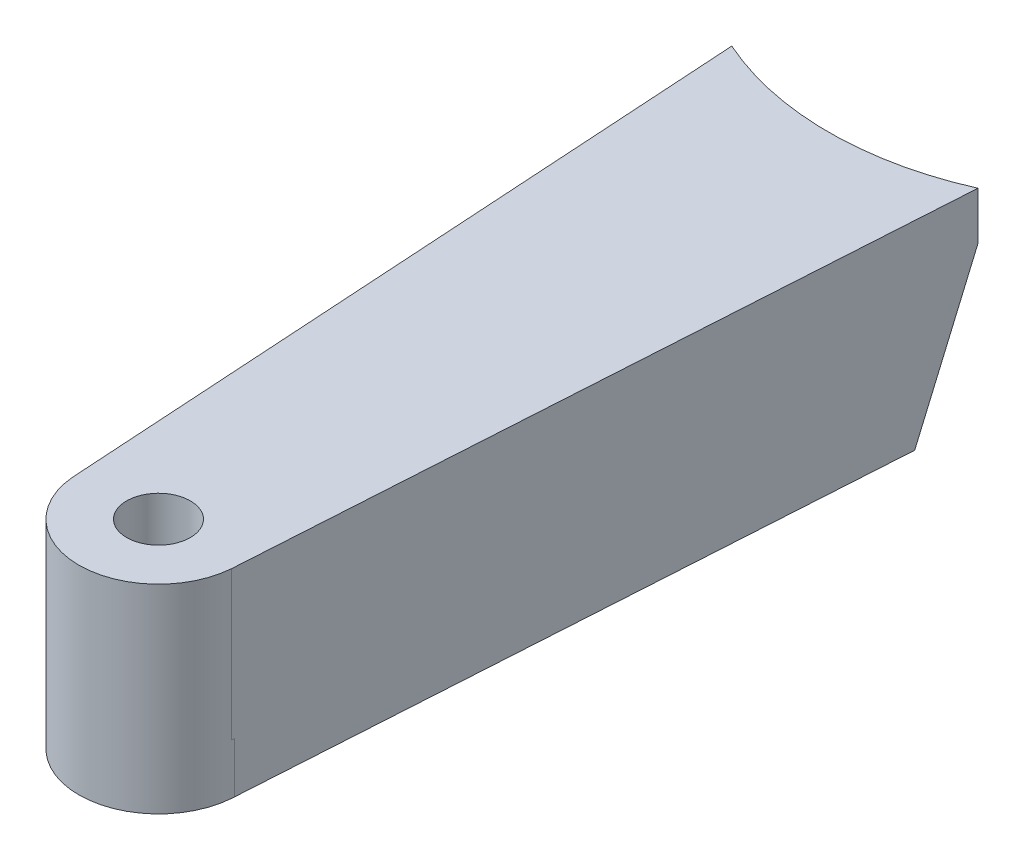
ISO-10303-21;
HEADER;
FILE_DESCRIPTION(('STEP AP214'),'2;1');
FILE_NAME('part.step','',(''),(''),'','','');
FILE_SCHEMA(('AUTOMOTIVE_DESIGN { 1 0 10303 214 1 1 1 1 }'));
ENDSEC;
DATA;
#1=APPLICATION_CONTEXT('core data for automotive mechanical design processes');
#2=APPLICATION_PROTOCOL_DEFINITION('international standard','automotive_design',2000,#1);
#3=PRODUCT_CONTEXT('',#1,'mechanical');
#4=PRODUCT('Part','Part','',(#3));
#5=PRODUCT_RELATED_PRODUCT_CATEGORY('part','',(#4));
#6=PRODUCT_DEFINITION_FORMATION('','',#4);
#7=PRODUCT_DEFINITION_CONTEXT('part definition',#1,'design');
#8=PRODUCT_DEFINITION('design','',#6,#7);
#9=PRODUCT_DEFINITION_SHAPE('','',#8);
#10=(LENGTH_UNIT() NAMED_UNIT(*) SI_UNIT(.MILLI.,.METRE.));
#11=(NAMED_UNIT(*) PLANE_ANGLE_UNIT() SI_UNIT($,.RADIAN.));
#12=(NAMED_UNIT(*) SI_UNIT($,.STERADIAN.) SOLID_ANGLE_UNIT());
#13=UNCERTAINTY_MEASURE_WITH_UNIT(LENGTH_MEASURE(1.E-05),#10,'distance_accuracy_value','');
#14=(GEOMETRIC_REPRESENTATION_CONTEXT(3) GLOBAL_UNCERTAINTY_ASSIGNED_CONTEXT((#13)) GLOBAL_UNIT_ASSIGNED_CONTEXT((#10,
#11,#12)) REPRESENTATION_CONTEXT('',''));
#15=CARTESIAN_POINT('',(0.,0.,0.));
#16=DIRECTION('',(0.,0.,1.));
#17=DIRECTION('',(1.,0.,0.));
#18=AXIS2_PLACEMENT_3D('',#15,#16,#17);
#19=CARTESIAN_POINT('',(15.,25.,80.));
#20=DIRECTION('',(0.,-1.,0.));
#21=DIRECTION('',(0.,0.,-1.));
#22=AXIS2_PLACEMENT_3D('',#19,#20,#21);
#23=CYLINDRICAL_SURFACE('',#22,10.);
#24=DIRECTION('',(0.,1.,0.));
#25=VECTOR('',#24,1.);
#26=CARTESIAN_POINT('',(20.5269931596302,0.,71.6661925500165));
#27=LINE('',#26,#25);
#28=CARTESIAN_POINT('',(20.5269931596302,6.35,71.6661925500165));
#29=VERTEX_POINT('',#28);
#30=CARTESIAN_POINT('',(20.5269931596302,19.,71.6661925500165));
#31=VERTEX_POINT('',#30);
#32=EDGE_CURVE('E128',#29,#31,#27,.T.);
#33=ORIENTED_EDGE('',*,*,#32,.F.);
#34=CARTESIAN_POINT('',(15.,6.35,80.));
#35=DIRECTION('',(0.,1.,0.));
#36=DIRECTION('',(0.,0.,1.));
#37=AXIS2_PLACEMENT_3D('',#34,#35,#36);
#38=CIRCLE('',#37,10.);
#39=CARTESIAN_POINT('',(5.00953868123267,6.35,80.436672232016));
#40=VERTEX_POINT('',#39);
#41=EDGE_CURVE('E264',#40,#29,#38,.F.);
#42=ORIENTED_EDGE('',*,*,#41,.F.);
#43=DIRECTION('',(0.,-1.,0.));
#44=VECTOR('',#43,1.);
#45=CARTESIAN_POINT('',(5.00953868123267,25.,80.436672232016));
#46=LINE('',#45,#44);
#47=CARTESIAN_POINT('',(5.00953868123267,19.,80.436672232016));
#48=VERTEX_POINT('',#47);
#49=EDGE_CURVE('E251',#48,#40,#46,.T.);
#50=ORIENTED_EDGE('',*,*,#49,.F.);
#51=CARTESIAN_POINT('',(15.,19.,80.));
#52=DIRECTION('',(0.,1.,0.));
#53=DIRECTION('',(0.,0.,1.));
#54=AXIS2_PLACEMENT_3D('',#51,#52,#53);
#55=CIRCLE('',#54,10.);
#56=EDGE_CURVE('E247',#31,#48,#55,.T.);
#57=ORIENTED_EDGE('',*,*,#56,.F.);
#58=EDGE_LOOP('',(#33,#42,#50,#57));
#59=FACE_BOUND('',#58,.T.);
#60=ADVANCED_FACE('F102',(#59),#23,.T.);
#61=CARTESIAN_POINT('',(0.,6.35,0.));
#62=DIRECTION('',(0.,1.,0.));
#63=DIRECTION('',(0.,0.,1.));
#64=AXIS2_PLACEMENT_3D('',#61,#62,#63);
#65=PLANE('',#64);
#66=ORIENTED_EDGE('',*,*,#41,.T.);
#67=DIRECTION('',(0.0621588566545773,0.,-0.998066268611156));
#68=VECTOR('',#67,1.);
#69=CARTESIAN_POINT('',(24.8937569531261,6.35,1.5503654603982));
#70=LINE('',#69,#68);
#71=CARTESIAN_POINT('',(24.8662216418089,6.35,1.99249176227189));
#72=VERTEX_POINT('',#71);
#73=EDGE_CURVE('E173',#29,#72,#70,.T.);
#74=ORIENTED_EDGE('',*,*,#73,.T.);
#75=CARTESIAN_POINT('',(15.,6.35,-31.0384337426189));
#76=DIRECTION('',(0.,1.,0.));
#77=DIRECTION('',(0.,0.,1.));
#78=AXIS2_PLACEMENT_3D('',#75,#76,#77);
#79=CIRCLE('',#78,34.4729512690014);
#80=CARTESIAN_POINT('',(0.,6.35,0.));
#81=VERTEX_POINT('',#80);
#82=EDGE_CURVE('E168',#81,#72,#79,.T.);
#83=ORIENTED_EDGE('',*,*,#82,.F.);
#84=DIRECTION('',(0.0621588566545779,0.,0.998066268611156));
#85=VECTOR('',#84,1.);
#86=CARTESIAN_POINT('',(0.,6.35,0.));
#87=LINE('',#86,#85);
#88=EDGE_CURVE('E421',#81,#40,#87,.T.);
#89=ORIENTED_EDGE('',*,*,#88,.T.);
#90=EDGE_LOOP('',(#66,#74,#83,#89));
#91=FACE_BOUND('',#90,.T.);
#92=ADVANCED_FACE('F315',(#91),#65,.T.);
#93=CARTESIAN_POINT('',(15.,6.35,-31.0384337426189));
#94=DIRECTION('',(0.,-1.,0.));
#95=DIRECTION('',(0.,0.,-1.));
#96=AXIS2_PLACEMENT_3D('',#93,#94,#95);
#97=CYLINDRICAL_SURFACE('',#96,34.4729512690014);
#98=ORIENTED_EDGE('',*,*,#82,.T.);
#99=DIRECTION('',(0.,-1.,0.));
#100=VECTOR('',#99,1.);
#101=CARTESIAN_POINT('',(24.8662216418089,6.35,1.99249176227189));
#102=LINE('',#101,#100);
#103=CARTESIAN_POINT('',(24.8662216418089,0.,1.99249176227188));
#104=VERTEX_POINT('',#103);
#105=EDGE_CURVE('E161',#72,#104,#102,.T.);
#106=ORIENTED_EDGE('',*,*,#105,.T.);
#107=CARTESIAN_POINT('',(15.,0.,-31.0384337426189));
#108=DIRECTION('',(0.,1.,0.));
#109=DIRECTION('',(0.,0.,1.));
#110=AXIS2_PLACEMENT_3D('',#107,#108,#109);
#111=CIRCLE('',#110,34.4729512690014);
#112=CARTESIAN_POINT('',(0.,0.,0.));
#113=VERTEX_POINT('',#112);
#114=EDGE_CURVE('E166',#113,#104,#111,.T.);
#115=ORIENTED_EDGE('',*,*,#114,.F.);
#116=DIRECTION('',(0.,-1.,0.));
#117=VECTOR('',#116,1.);
#118=CARTESIAN_POINT('',(0.,6.35,0.));
#119=LINE('',#118,#117);
#120=EDGE_CURVE('E260',#81,#113,#119,.T.);
#121=ORIENTED_EDGE('',*,*,#120,.F.);
#122=EDGE_LOOP('',(#98,#106,#115,#121));
#123=FACE_BOUND('',#122,.T.);
#124=ADVANCED_FACE('F163',(#123),#97,.F.);
#125=CARTESIAN_POINT('',(0.,19.,0.));
#126=DIRECTION('',(0.,1.,0.));
#127=DIRECTION('',(0.,0.,1.));
#128=AXIS2_PLACEMENT_3D('',#125,#126,#127);
#129=PLANE('',#128);
#130=DIRECTION('',(-0.0621588566545773,0.,0.998066268611156));
#131=VECTOR('',#130,1.);
#132=CARTESIAN_POINT('',(24.8937569531261,19.,1.5503654603982));
#133=LINE('',#132,#131);
#134=CARTESIAN_POINT('',(25.3411495067401,19.,-5.63328367059114));
#135=VERTEX_POINT('',#134);
#136=EDGE_CURVE('E204',#135,#31,#133,.T.);
#137=ORIENTED_EDGE('',*,*,#136,.T.);
#138=ORIENTED_EDGE('',*,*,#56,.T.);
#139=DIRECTION('',(0.0621588566545778,0.,0.998066268611156));
#140=VECTOR('',#139,1.);
#141=CARTESIAN_POINT('',(0.,19.,0.));
#142=LINE('',#141,#140);
#143=CARTESIAN_POINT('',(-0.466218615116113,19.,-7.48593359964466));
#144=VERTEX_POINT('',#143);
#145=EDGE_CURVE('E230',#144,#48,#142,.T.);
#146=ORIENTED_EDGE('',*,*,#145,.F.);
#147=CARTESIAN_POINT('',(15.,19.,-42.2556521929486));
#148=DIRECTION('',(0.,1.,0.));
#149=DIRECTION('',(0.,0.,1.));
#150=AXIS2_PLACEMENT_3D('',#147,#148,#149);
#151=CIRCLE('',#150,38.0543985540189);
#152=EDGE_CURVE('E227',#144,#135,#151,.T.);
#153=ORIENTED_EDGE('',*,*,#152,.T.);
#154=EDGE_LOOP('',(#137,#138,#146,#153));
#155=FACE_BOUND('',#154,.T.);
#156=ADVANCED_FACE('F418',(#155),#129,.F.);
#157=CARTESIAN_POINT('',(0.,6.35,0.));
#158=DIRECTION('',(0.998066268611156,0.,-0.0621588566545778));
#159=DIRECTION('',(-0.0621588566545779,0.,-0.998066268611156));
#160=AXIS2_PLACEMENT_3D('',#157,#158,#159);
#161=PLANE('',#160);
#162=DIRECTION('',(0.0621588566545779,0.,0.998066268611156));
#163=VECTOR('',#162,1.);
#164=CARTESIAN_POINT('',(0.,0.,0.));
#165=LINE('',#164,#163);
#166=CARTESIAN_POINT('',(5.00953868123267,0.,80.436672232016));
#167=VERTEX_POINT('',#166);
#168=EDGE_CURVE('E186',#113,#167,#165,.T.);
#169=ORIENTED_EDGE('',*,*,#168,.T.);
#170=DIRECTION('',(0.,-1.,0.));
#171=VECTOR('',#170,1.);
#172=CARTESIAN_POINT('',(5.00953868123267,6.35,80.436672232016));
#173=LINE('',#172,#171);
#174=EDGE_CURVE('E265',#40,#167,#173,.T.);
#175=ORIENTED_EDGE('',*,*,#174,.F.);
#176=ORIENTED_EDGE('',*,*,#88,.F.);
#177=ORIENTED_EDGE('',*,*,#120,.T.);
#178=EDGE_LOOP('',(#169,#175,#176,#177));
#179=FACE_BOUND('',#178,.T.);
#180=ADVANCED_FACE('F462',(#179),#161,.F.);
#181=CARTESIAN_POINT('',(29.8840882961819,6.35,1.8611597436711));
#182=DIRECTION('',(-0.998066268611156,0.,-0.0621588566545776));
#183=DIRECTION('',(-0.0621588566545776,0.,0.998066268611156));
#184=AXIS2_PLACEMENT_3D('',#181,#182,#183);
#185=PLANE('',#184);
#186=DIRECTION('',(0.0621588566545776,0.,-0.998066268611156));
#187=VECTOR('',#186,1.);
#188=CARTESIAN_POINT('',(29.8840882961819,0.,1.8611597436711));
#189=LINE('',#188,#187);
#190=CARTESIAN_POINT('',(24.9904613187673,0.,80.4366722320161));
#191=VERTEX_POINT('',#190);
#192=CARTESIAN_POINT('',(30.,0.,0.));
#193=VERTEX_POINT('',#192);
#194=EDGE_CURVE('E285',#191,#193,#189,.T.);
#195=ORIENTED_EDGE('',*,*,#194,.T.);
#196=DIRECTION('',(0.0228238036498484,0.930147907627287,-0.366475024965594));
#197=VECTOR('',#196,1.);
#198=CARTESIAN_POINT('',(30.,0.,0.));
#199=LINE('',#198,#197);
#200=CARTESIAN_POINT('',(30.4662186151161,19.,-7.48593359964466));
#201=VERTEX_POINT('',#200);
#202=EDGE_CURVE('E198',#193,#201,#199,.T.);
#203=ORIENTED_EDGE('',*,*,#202,.T.);
#204=DIRECTION('',(0.,1.,0.));
#205=VECTOR('',#204,1.);
#206=CARTESIAN_POINT('',(30.4662186151161,19.,-7.48593359964466));
#207=LINE('',#206,#205);
#208=CARTESIAN_POINT('',(30.4662186151161,25.,-7.48593359964466));
#209=VERTEX_POINT('',#208);
#210=EDGE_CURVE('E241',#201,#209,#207,.T.);
#211=ORIENTED_EDGE('',*,*,#210,.T.);
#212=DIRECTION('',(0.0621588566545776,0.,-0.998066268611156));
#213=VECTOR('',#212,1.);
#214=CARTESIAN_POINT('',(29.8840882961819,25.,1.8611597436711));
#215=LINE('',#214,#213);
#216=CARTESIAN_POINT('',(24.9674416778354,25.,80.8062917579577));
#217=VERTEX_POINT('',#216);
#218=EDGE_CURVE('E437',#217,#209,#215,.T.);
#219=ORIENTED_EDGE('',*,*,#218,.F.);
#220=DIRECTION('',(0.,-1.,0.));
#221=VECTOR('',#220,1.);
#222=CARTESIAN_POINT('',(24.9674416778354,25.,80.8062917579577));
#223=LINE('',#222,#221);
#224=CARTESIAN_POINT('',(24.9674416778354,6.35,80.8062917579577));
#225=VERTEX_POINT('',#224);
#226=EDGE_CURVE('E351',#217,#225,#223,.T.);
#227=ORIENTED_EDGE('',*,*,#226,.T.);
#228=CARTESIAN_POINT('',(15.,6.35,80.));
#229=DIRECTION('',(0.,-1.,0.));
#230=DIRECTION('',(0.999046131876732,0.,0.0436672232016127));
#231=AXIS2_PLACEMENT_3D('',#228,#229,#230);
#232=CIRCLE('',#231,10.);
#233=CARTESIAN_POINT('',(24.9904613187673,6.35,80.4366722320161));
#234=VERTEX_POINT('',#233);
#235=EDGE_CURVE('E270',#234,#225,#232,.T.);
#236=ORIENTED_EDGE('',*,*,#235,.F.);
#237=DIRECTION('',(0.,-1.,0.));
#238=VECTOR('',#237,1.);
#239=CARTESIAN_POINT('',(24.9904613187673,6.35,80.4366722320161));
#240=LINE('',#239,#238);
#241=EDGE_CURVE('E347',#234,#191,#240,.T.);
#242=ORIENTED_EDGE('',*,*,#241,.T.);
#243=EDGE_LOOP('',(#195,#203,#211,#219,#227,#236,#242));
#244=FACE_BOUND('',#243,.T.);
#245=ADVANCED_FACE('F314',(#244),#185,.F.);
#246=CARTESIAN_POINT('',(0.,0.,0.));
#247=DIRECTION('',(0.,1.,0.));
#248=DIRECTION('',(0.,0.,1.));
#249=AXIS2_PLACEMENT_3D('',#246,#247,#248);
#250=PLANE('',#249);
#251=ORIENTED_EDGE('',*,*,#194,.F.);
#252=CARTESIAN_POINT('',(15.,0.,80.));
#253=DIRECTION('',(0.,1.,0.));
#254=DIRECTION('',(0.996744167783532,0.,0.0806291757958265));
#255=AXIS2_PLACEMENT_3D('',#252,#253,#254);
#256=CIRCLE('',#255,10.);
#257=CARTESIAN_POINT('',(24.9674416778353,0.,80.8062917579583));
#258=VERTEX_POINT('',#257);
#259=EDGE_CURVE('E12',#258,#191,#256,.T.);
#260=ORIENTED_EDGE('',*,*,#259,.F.);
#261=CARTESIAN_POINT('',(15.,0.,80.));
#262=DIRECTION('',(0.,1.,0.));
#263=DIRECTION('',(0.,0.,1.));
#264=AXIS2_PLACEMENT_3D('',#261,#262,#263);
#265=CIRCLE('',#264,10.);
#266=CARTESIAN_POINT('',(5.03255832216463,0.,80.8062917579577));
#267=VERTEX_POINT('',#266);
#268=EDGE_CURVE('E188',#267,#258,#265,.T.);
#269=ORIENTED_EDGE('',*,*,#268,.F.);
#270=CARTESIAN_POINT('',(15.,0.,80.));
#271=DIRECTION('',(0.,1.,0.));
#272=DIRECTION('',(-0.999046131876733,0.,0.043667223201596));
#273=AXIS2_PLACEMENT_3D('',#270,#271,#272);
#274=CIRCLE('',#273,10.);
#275=EDGE_CURVE('E120',#167,#267,#274,.T.);
#276=ORIENTED_EDGE('',*,*,#275,.F.);
#277=ORIENTED_EDGE('',*,*,#168,.F.);
#278=ORIENTED_EDGE('',*,*,#114,.T.);
#279=CARTESIAN_POINT('',(15.,0.,-31.0384337426189));
#280=DIRECTION('',(0.,-1.,0.));
#281=DIRECTION('',(0.,0.,-1.));
#282=AXIS2_PLACEMENT_3D('',#279,#280,#281);
#283=CIRCLE('',#282,34.4729512690014);
#284=EDGE_CURVE('E181',#104,#193,#283,.F.);
#285=ORIENTED_EDGE('',*,*,#284,.T.);
#286=EDGE_LOOP('',(#251,#260,#269,#276,#277,#278,#285));
#287=FACE_BOUND('',#286,.T.);
#288=CARTESIAN_POINT('',(15.,0.,80.));
#289=DIRECTION('',(0.,1.,0.));
#290=DIRECTION('',(0.,0.,1.));
#291=AXIS2_PLACEMENT_3D('',#288,#289,#290);
#292=CIRCLE('',#291,4.00000000000002);
#293=CARTESIAN_POINT('',(15.,0.,84.));
#294=VERTEX_POINT('',#293);
#295=EDGE_CURVE('E266',#294,#294,#292,.T.);
#296=ORIENTED_EDGE('',*,*,#295,.T.);
#297=EDGE_LOOP('',(#296));
#298=FACE_BOUND('',#297,.T.);
#299=ADVANCED_FACE('F178',(#287,#298),#250,.F.);
#300=CARTESIAN_POINT('',(15.,6.35,80.));
#301=DIRECTION('',(0.,-1.,0.));
#302=DIRECTION('',(0.,0.,-1.));
#303=AXIS2_PLACEMENT_3D('',#300,#301,#302);
#304=CYLINDRICAL_SURFACE('',#303,4.00000000000002);
#305=CARTESIAN_POINT('',(15.,25.,80.));
#306=DIRECTION('',(0.,1.,0.));
#307=DIRECTION('',(0.,0.,1.));
#308=AXIS2_PLACEMENT_3D('',#305,#306,#307);
#309=CIRCLE('',#308,4.00000000000002);
#310=CARTESIAN_POINT('',(15.,25.,84.));
#311=VERTEX_POINT('',#310);
#312=EDGE_CURVE('E244',#311,#311,#309,.T.);
#313=ORIENTED_EDGE('',*,*,#312,.T.);
#314=EDGE_LOOP('',(#313));
#315=FACE_BOUND('',#314,.T.);
#316=ORIENTED_EDGE('',*,*,#295,.F.);
#317=EDGE_LOOP('',(#316));
#318=FACE_BOUND('',#317,.T.);
#319=ADVANCED_FACE('F313',(#315,#318),#304,.F.);
#320=CARTESIAN_POINT('',(15.,6.35,80.));
#321=DIRECTION('',(0.,-1.,0.));
#322=DIRECTION('',(0.,0.,-1.));
#323=AXIS2_PLACEMENT_3D('',#320,#321,#322);
#324=CYLINDRICAL_SURFACE('',#323,10.);
#325=DIRECTION('',(0.,-1.,0.));
#326=VECTOR('',#325,1.);
#327=CARTESIAN_POINT('',(5.03255832216465,25.,80.8062917579577));
#328=LINE('',#327,#326);
#329=CARTESIAN_POINT('',(5.03255832216465,25.,80.8062917579577));
#330=VERTEX_POINT('',#329);
#331=CARTESIAN_POINT('',(5.03255832216469,6.35,80.8062917579584));
#332=VERTEX_POINT('',#331);
#333=EDGE_CURVE('E365',#330,#332,#328,.T.);
#334=ORIENTED_EDGE('',*,*,#333,.T.);
#335=CARTESIAN_POINT('',(15.,6.35,80.));
#336=DIRECTION('',(0.,-1.,0.));
#337=DIRECTION('',(-0.996744167783531,0.,0.080629175795839));
#338=AXIS2_PLACEMENT_3D('',#335,#336,#337);
#339=CIRCLE('',#338,10.);
#340=EDGE_CURVE('E356',#332,#40,#339,.T.);
#341=ORIENTED_EDGE('',*,*,#340,.T.);
#342=ORIENTED_EDGE('',*,*,#174,.T.);
#343=ORIENTED_EDGE('',*,*,#275,.T.);
#344=ORIENTED_EDGE('',*,*,#268,.T.);
#345=ORIENTED_EDGE('',*,*,#259,.T.);
#346=ORIENTED_EDGE('',*,*,#241,.F.);
#347=ORIENTED_EDGE('',*,*,#235,.T.);
#348=ORIENTED_EDGE('',*,*,#226,.F.);
#349=CARTESIAN_POINT('',(15.,25.,80.));
#350=DIRECTION('',(0.,1.,0.));
#351=DIRECTION('',(0.,0.,1.));
#352=AXIS2_PLACEMENT_3D('',#349,#350,#351);
#353=CIRCLE('',#352,10.);
#354=EDGE_CURVE('E374',#330,#217,#353,.T.);
#355=ORIENTED_EDGE('',*,*,#354,.F.);
#356=EDGE_LOOP('',(#334,#341,#342,#343,#344,#345,#346,#347,#348,#355));
#357=FACE_BOUND('',#356,.T.);
#358=ADVANCED_FACE('F104',(#357),#324,.T.);
#359=CARTESIAN_POINT('',(0.,25.,0.));
#360=DIRECTION('',(0.998066268611156,0.,-0.0621588566545778));
#361=DIRECTION('',(-0.0621588566545778,0.,-0.998066268611156));
#362=AXIS2_PLACEMENT_3D('',#359,#360,#361);
#363=PLANE('',#362);
#364=DIRECTION('',(0.0621588566545779,0.,0.998066268611156));
#365=VECTOR('',#364,1.);
#366=CARTESIAN_POINT('',(0.,25.,0.));
#367=LINE('',#366,#365);
#368=CARTESIAN_POINT('',(-0.466218615116113,25.,-7.48593359964466));
#369=VERTEX_POINT('',#368);
#370=EDGE_CURVE('E414',#369,#330,#367,.T.);
#371=ORIENTED_EDGE('',*,*,#370,.F.);
#372=DIRECTION('',(0.,1.,0.));
#373=VECTOR('',#372,1.);
#374=CARTESIAN_POINT('',(-0.466218615116113,19.,-7.48593359964466));
#375=LINE('',#374,#373);
#376=EDGE_CURVE('E234',#144,#369,#375,.T.);
#377=ORIENTED_EDGE('',*,*,#376,.F.);
#378=ORIENTED_EDGE('',*,*,#145,.T.);
#379=ORIENTED_EDGE('',*,*,#49,.T.);
#380=ORIENTED_EDGE('',*,*,#340,.F.);
#381=ORIENTED_EDGE('',*,*,#333,.F.);
#382=EDGE_LOOP('',(#371,#377,#378,#379,#380,#381));
#383=FACE_BOUND('',#382,.T.);
#384=ADVANCED_FACE('F387',(#383),#363,.F.);
#385=CARTESIAN_POINT('',(0.,25.,0.));
#386=DIRECTION('',(0.,1.,0.));
#387=DIRECTION('',(0.,0.,1.));
#388=AXIS2_PLACEMENT_3D('',#385,#386,#387);
#389=PLANE('',#388);
#390=ORIENTED_EDGE('',*,*,#312,.F.);
#391=EDGE_LOOP('',(#390));
#392=FACE_BOUND('',#391,.T.);
#393=ORIENTED_EDGE('',*,*,#218,.T.);
#394=CARTESIAN_POINT('',(15.,25.,-42.2556521929486));
#395=DIRECTION('',(0.,1.,0.));
#396=DIRECTION('',(0.,0.,1.));
#397=AXIS2_PLACEMENT_3D('',#394,#395,#396);
#398=CIRCLE('',#397,38.0543985540189);
#399=EDGE_CURVE('E226',#369,#209,#398,.T.);
#400=ORIENTED_EDGE('',*,*,#399,.F.);
#401=ORIENTED_EDGE('',*,*,#370,.T.);
#402=ORIENTED_EDGE('',*,*,#354,.T.);
#403=EDGE_LOOP('',(#393,#400,#401,#402));
#404=FACE_BOUND('',#403,.T.);
#405=ADVANCED_FACE('F442',(#392,#404),#389,.T.);
#406=CARTESIAN_POINT('',(15.,19.,-42.2556521929486));
#407=DIRECTION('',(0.,1.,0.));
#408=DIRECTION('',(0.,0.,1.));
#409=AXIS2_PLACEMENT_3D('',#406,#407,#408);
#410=CYLINDRICAL_SURFACE('',#409,38.0543985540189);
#411=ORIENTED_EDGE('',*,*,#399,.T.);
#412=ORIENTED_EDGE('',*,*,#210,.F.);
#413=CARTESIAN_POINT('',(25.3411495067401,19.,-5.63328367059114));
#414=CARTESIAN_POINT('',(25.5634307647194,18.9999982865553,-5.69604955631849));
#415=CARTESIAN_POINT('',(25.7851401511294,18.9999715300148,-5.76083949795835));
#416=CARTESIAN_POINT('',(26.2273381609043,18.9998973504116,-5.89444388902026));
#417=CARTESIAN_POINT('',(26.4478268085075,18.9998499277608,-5.96325825821972));
#418=CARTESIAN_POINT('',(26.8875152109379,18.9997638331885,-6.10489041184781));
#419=CARTESIAN_POINT('',(27.1067149656154,18.999725161268,-6.17770819674147));
#420=CARTESIAN_POINT('',(27.5437543592378,18.9996710515079,-6.32732313397584));
#421=CARTESIAN_POINT('',(27.7615939713275,18.9996556141256,-6.40412036461171));
#422=CARTESIAN_POINT('',(28.3989815046831,18.9996615849988,-6.63537172555238));
#423=CARTESIAN_POINT('',(28.816571438893,18.9997309762161,-6.79526030027455));
#424=CARTESIAN_POINT('',(29.6459217957341,18.9998839948503,-7.12967517395501));
#425=CARTESIAN_POINT('',(30.0576813281667,18.9999676244162,-7.30420368059517));
#426=CARTESIAN_POINT('',(30.4662186151161,19.,-7.48593359964466));
#427=B_SPLINE_CURVE_WITH_KNOTS('',3,(#413,#414,#415,#416,#417,#418,#419,#420,#421,#422,#423,
#424,#425,#426),.UNSPECIFIED.,.F.,.F.,(4,2,2,2,2,2,4),(0.,0.692908706826664,1.38580360597721,
2.07869858561452,2.77160720306575,4.11277067383841,5.45413675508393),.UNSPECIFIED.);
#428=EDGE_CURVE('E107',#135,#201,#427,.T.);
#429=ORIENTED_EDGE('',*,*,#428,.F.);
#430=ORIENTED_EDGE('',*,*,#152,.F.);
#431=ORIENTED_EDGE('',*,*,#376,.T.);
#432=EDGE_LOOP('',(#411,#412,#429,#430,#431));
#433=FACE_BOUND('',#432,.T.);
#434=ADVANCED_FACE('F416',(#433),#410,.F.);
#435=CARTESIAN_POINT('',(24.8937569531261,0.,1.5503654603982));
#436=DIRECTION('',(0.998066268611156,0.,0.0621588566545773));
#437=DIRECTION('',(0.0621588566545773,0.,-0.998066268611156));
#438=AXIS2_PLACEMENT_3D('',#435,#436,#437);
#439=PLANE('',#438);
#440=ORIENTED_EDGE('',*,*,#73,.F.);
#441=ORIENTED_EDGE('',*,*,#32,.T.);
#442=ORIENTED_EDGE('',*,*,#136,.F.);
#443=DIRECTION('',(0.0231912856538289,0.927792323759753,-0.372375574175054));
#444=VECTOR('',#443,1.);
#445=CARTESIAN_POINT('',(25.1036855742745,9.5,-1.82039595415963));
#446=LINE('',#445,#444);
#447=EDGE_CURVE('E195',#104,#135,#446,.T.);
#448=ORIENTED_EDGE('',*,*,#447,.F.);
#449=ORIENTED_EDGE('',*,*,#105,.F.);
#450=EDGE_LOOP('',(#440,#441,#442,#448,#449));
#451=FACE_BOUND('',#450,.T.);
#452=ADVANCED_FACE('F203',(#451),#439,.F.);
#453=CARTESIAN_POINT('',(30.,0.,0.));
#454=CARTESIAN_POINT('',(30.4662186151161,19.,-7.48593359964466));
#455=CARTESIAN_POINT('',(28.3472562595609,0.,0.798724456013552));
#456=CARTESIAN_POINT('',(28.8064659405488,19.,-6.74764468761348));
#457=CARTESIAN_POINT('',(26.6250621755101,0.,1.46713226135435));
#458=CARTESIAN_POINT('',(27.0893394997323,19.,-6.12692443750886));
#459=CARTESIAN_POINT('',(24.8662216418089,0.,1.99249176227188));
#460=CARTESIAN_POINT('',(25.3411495067401,19.,-5.63328367059114));
#461=B_SPLINE_SURFACE_WITH_KNOTS('',3,1,((#453,#454),(#455,#456),(#457,#458),(#459,#460)),
.UNSPECIFIED.,.F.,.F.,.F.,(4,4),(2,2),(0.,1.),(0.,1.),.UNSPECIFIED.);
#462=ORIENTED_EDGE('',*,*,#284,.F.);
#463=ORIENTED_EDGE('',*,*,#447,.T.);
#464=ORIENTED_EDGE('',*,*,#428,.T.);
#465=ORIENTED_EDGE('',*,*,#202,.F.);
#466=EDGE_LOOP('',(#462,#463,#464,#465));
#467=FACE_BOUND('',#466,.T.);
#468=ADVANCED_FACE('F194',(#467),#461,.T.);
#469=CLOSED_SHELL('',(#60,#92,#124,#156,#180,#245,#299,#319,#358,#384,#405,#434,#452,#468));
#470=MANIFOLD_SOLID_BREP('B2',#469);
#471=ADVANCED_BREP_SHAPE_REPRESENTATION('',(#18,#470),#14);
#472=SHAPE_DEFINITION_REPRESENTATION(#9,#471);
ENDSEC;
END-ISO-10303-21;
